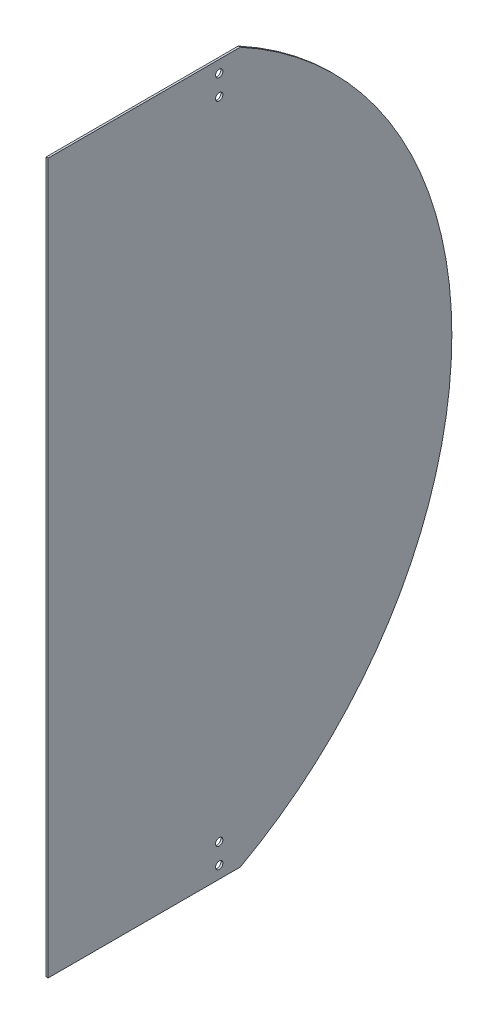
ISO-10303-21;
HEADER;
FILE_DESCRIPTION(('STEP AP214'),'2;1');
FILE_NAME('part.step','',(''),(''),'','','');
FILE_SCHEMA(('AUTOMOTIVE_DESIGN { 1 0 10303 214 1 1 1 1 }'));
ENDSEC;
DATA;
#1=APPLICATION_CONTEXT('core data for automotive mechanical design processes');
#2=APPLICATION_PROTOCOL_DEFINITION('international standard','automotive_design',2000,#1);
#3=PRODUCT_CONTEXT('',#1,'mechanical');
#4=PRODUCT('Part','Part','',(#3));
#5=PRODUCT_RELATED_PRODUCT_CATEGORY('part','',(#4));
#6=PRODUCT_DEFINITION_FORMATION('','',#4);
#7=PRODUCT_DEFINITION_CONTEXT('part definition',#1,'design');
#8=PRODUCT_DEFINITION('design','',#6,#7);
#9=PRODUCT_DEFINITION_SHAPE('','',#8);
#10=(LENGTH_UNIT() NAMED_UNIT(*) SI_UNIT(.MILLI.,.METRE.));
#11=(NAMED_UNIT(*) PLANE_ANGLE_UNIT() SI_UNIT($,.RADIAN.));
#12=(NAMED_UNIT(*) SI_UNIT($,.STERADIAN.) SOLID_ANGLE_UNIT());
#13=UNCERTAINTY_MEASURE_WITH_UNIT(LENGTH_MEASURE(1.E-05),#10,'distance_accuracy_value','');
#14=(GEOMETRIC_REPRESENTATION_CONTEXT(3) GLOBAL_UNCERTAINTY_ASSIGNED_CONTEXT((#13)) GLOBAL_UNIT_ASSIGNED_CONTEXT((#10,
#11,#12)) REPRESENTATION_CONTEXT('',''));
#15=CARTESIAN_POINT('',(0.,0.,0.));
#16=DIRECTION('',(0.,0.,1.));
#17=DIRECTION('',(1.,0.,0.));
#18=AXIS2_PLACEMENT_3D('',#15,#16,#17);
#19=CARTESIAN_POINT('',(-7.5,-398.,-211.));
#20=DIRECTION('',(1.,0.,0.));
#21=DIRECTION('',(0.,0.,-1.));
#22=AXIS2_PLACEMENT_3D('',#19,#20,#21);
#23=CYLINDRICAL_SURFACE('',#22,4.49999999999999);
#24=CARTESIAN_POINT('',(2.5,-398.,-211.));
#25=DIRECTION('',(-1.,0.,0.));
#26=DIRECTION('',(0.,0.,-1.));
#27=AXIS2_PLACEMENT_3D('',#24,#25,#26);
#28=CIRCLE('',#27,4.49999999999999);
#29=CARTESIAN_POINT('',(2.5,-398.,-215.5));
#30=VERTEX_POINT('',#29);
#31=EDGE_CURVE('E51',#30,#30,#28,.T.);
#32=ORIENTED_EDGE('',*,*,#31,.F.);
#33=EDGE_LOOP('',(#32));
#34=FACE_BOUND('',#33,.T.);
#35=CARTESIAN_POINT('',(0.,-398.,-211.));
#36=DIRECTION('',(-1.,0.,0.));
#37=DIRECTION('',(0.,0.,-1.));
#38=AXIS2_PLACEMENT_3D('',#35,#36,#37);
#39=CIRCLE('',#38,4.49999999999999);
#40=CARTESIAN_POINT('',(0.,-398.,-215.5));
#41=VERTEX_POINT('',#40);
#42=EDGE_CURVE('E11',#41,#41,#39,.T.);
#43=ORIENTED_EDGE('',*,*,#42,.T.);
#44=EDGE_LOOP('',(#43));
#45=FACE_BOUND('',#44,.T.);
#46=ADVANCED_FACE('F42',(#34,#45),#23,.F.);
#47=CARTESIAN_POINT('',(-7.5,-423.,-211.));
#48=DIRECTION('',(1.,0.,0.));
#49=DIRECTION('',(0.,0.,-1.));
#50=AXIS2_PLACEMENT_3D('',#47,#48,#49);
#51=CYLINDRICAL_SURFACE('',#50,4.49999999999999);
#52=CARTESIAN_POINT('',(2.5,-423.,-211.));
#53=DIRECTION('',(-1.,0.,0.));
#54=DIRECTION('',(0.,0.,-1.));
#55=AXIS2_PLACEMENT_3D('',#52,#53,#54);
#56=CIRCLE('',#55,4.49999999999999);
#57=CARTESIAN_POINT('',(2.5,-423.,-215.5));
#58=VERTEX_POINT('',#57);
#59=EDGE_CURVE('E132',#58,#58,#56,.T.);
#60=ORIENTED_EDGE('',*,*,#59,.F.);
#61=EDGE_LOOP('',(#60));
#62=FACE_BOUND('',#61,.T.);
#63=CARTESIAN_POINT('',(0.,-423.,-211.));
#64=DIRECTION('',(-1.,0.,0.));
#65=DIRECTION('',(0.,0.,-1.));
#66=AXIS2_PLACEMENT_3D('',#63,#64,#65);
#67=CIRCLE('',#66,4.49999999999999);
#68=CARTESIAN_POINT('',(0.,-423.,-215.5));
#69=VERTEX_POINT('',#68);
#70=EDGE_CURVE('E145',#69,#69,#67,.T.);
#71=ORIENTED_EDGE('',*,*,#70,.T.);
#72=EDGE_LOOP('',(#71));
#73=FACE_BOUND('',#72,.T.);
#74=ADVANCED_FACE('F157',(#62,#73),#51,.F.);
#75=CARTESIAN_POINT('',(2.5,0.,0.));
#76=DIRECTION('',(-1.,0.,0.));
#77=DIRECTION('',(0.,0.,1.));
#78=AXIS2_PLACEMENT_3D('',#75,#76,#77);
#79=CYLINDRICAL_SURFACE('',#78,498.);
#80=CARTESIAN_POINT('',(0.,0.,0.));
#81=DIRECTION('',(1.,0.,0.));
#82=DIRECTION('',(0.,0.,-1.));
#83=AXIS2_PLACEMENT_3D('',#80,#81,#82);
#84=CIRCLE('',#83,498.);
#85=CARTESIAN_POINT('',(0.,-438.,-236.981011897578));
#86=VERTEX_POINT('',#85);
#87=CARTESIAN_POINT('',(0.,438.,-236.981011897578));
#88=VERTEX_POINT('',#87);
#89=EDGE_CURVE('E115',#86,#88,#84,.T.);
#90=ORIENTED_EDGE('',*,*,#89,.T.);
#91=DIRECTION('',(-1.,0.,0.));
#92=VECTOR('',#91,1.);
#93=CARTESIAN_POINT('',(2.5,438.,-236.981011897578));
#94=LINE('',#93,#92);
#95=CARTESIAN_POINT('',(2.5,438.,-236.981011897578));
#96=VERTEX_POINT('',#95);
#97=EDGE_CURVE('E103',#96,#88,#94,.T.);
#98=ORIENTED_EDGE('',*,*,#97,.F.);
#99=CARTESIAN_POINT('',(2.5,0.,0.));
#100=DIRECTION('',(1.,0.,0.));
#101=DIRECTION('',(0.,0.,-1.));
#102=AXIS2_PLACEMENT_3D('',#99,#100,#101);
#103=CIRCLE('',#102,498.);
#104=CARTESIAN_POINT('',(2.5,-438.,-236.981011897578));
#105=VERTEX_POINT('',#104);
#106=EDGE_CURVE('E95',#105,#96,#103,.T.);
#107=ORIENTED_EDGE('',*,*,#106,.F.);
#108=DIRECTION('',(-1.,0.,0.));
#109=VECTOR('',#108,1.);
#110=CARTESIAN_POINT('',(2.5,-438.,-236.981011897578));
#111=LINE('',#110,#109);
#112=EDGE_CURVE('E111',#105,#86,#111,.T.);
#113=ORIENTED_EDGE('',*,*,#112,.T.);
#114=EDGE_LOOP('',(#90,#98,#107,#113));
#115=FACE_BOUND('',#114,.T.);
#116=ADVANCED_FACE('F172',(#115),#79,.T.);
#117=CARTESIAN_POINT('',(2.5,438.,0.));
#118=DIRECTION('',(0.,-1.,0.));
#119=DIRECTION('',(0.,0.,-1.));
#120=AXIS2_PLACEMENT_3D('',#117,#118,#119);
#121=PLANE('',#120);
#122=DIRECTION('',(0.,0.,1.));
#123=VECTOR('',#122,1.);
#124=CARTESIAN_POINT('',(0.,438.,0.));
#125=LINE('',#124,#123);
#126=CARTESIAN_POINT('',(0.,438.,0.));
#127=VERTEX_POINT('',#126);
#128=EDGE_CURVE('E101',#88,#127,#125,.T.);
#129=ORIENTED_EDGE('',*,*,#128,.T.);
#130=DIRECTION('',(-1.,0.,0.));
#131=VECTOR('',#130,1.);
#132=CARTESIAN_POINT('',(2.5,438.,0.));
#133=LINE('',#132,#131);
#134=CARTESIAN_POINT('',(2.5,438.,0.));
#135=VERTEX_POINT('',#134);
#136=EDGE_CURVE('E99',#135,#127,#133,.T.);
#137=ORIENTED_EDGE('',*,*,#136,.F.);
#138=DIRECTION('',(0.,0.,1.));
#139=VECTOR('',#138,1.);
#140=CARTESIAN_POINT('',(2.5,438.,0.));
#141=LINE('',#140,#139);
#142=EDGE_CURVE('E90',#96,#135,#141,.T.);
#143=ORIENTED_EDGE('',*,*,#142,.F.);
#144=ORIENTED_EDGE('',*,*,#97,.T.);
#145=EDGE_LOOP('',(#129,#137,#143,#144));
#146=FACE_BOUND('',#145,.T.);
#147=ADVANCED_FACE('F100',(#146),#121,.F.);
#148=CARTESIAN_POINT('',(2.5,-438.,0.));
#149=DIRECTION('',(0.,0.,-1.));
#150=DIRECTION('',(-1.,0.,0.));
#151=AXIS2_PLACEMENT_3D('',#148,#149,#150);
#152=PLANE('',#151);
#153=DIRECTION('',(0.,-1.,0.));
#154=VECTOR('',#153,1.);
#155=CARTESIAN_POINT('',(0.,-438.,0.));
#156=LINE('',#155,#154);
#157=CARTESIAN_POINT('',(0.,-438.,0.));
#158=VERTEX_POINT('',#157);
#159=EDGE_CURVE('E76',#127,#158,#156,.T.);
#160=ORIENTED_EDGE('',*,*,#159,.T.);
#161=DIRECTION('',(-1.,0.,0.));
#162=VECTOR('',#161,1.);
#163=CARTESIAN_POINT('',(2.5,-438.,0.));
#164=LINE('',#163,#162);
#165=CARTESIAN_POINT('',(2.5,-438.,0.));
#166=VERTEX_POINT('',#165);
#167=EDGE_CURVE('E104',#166,#158,#164,.T.);
#168=ORIENTED_EDGE('',*,*,#167,.F.);
#169=DIRECTION('',(0.,-1.,0.));
#170=VECTOR('',#169,1.);
#171=CARTESIAN_POINT('',(2.5,-438.,0.));
#172=LINE('',#171,#170);
#173=EDGE_CURVE('E93',#135,#166,#172,.T.);
#174=ORIENTED_EDGE('',*,*,#173,.F.);
#175=ORIENTED_EDGE('',*,*,#136,.T.);
#176=EDGE_LOOP('',(#160,#168,#174,#175));
#177=FACE_BOUND('',#176,.T.);
#178=ADVANCED_FACE('F106',(#177),#152,.F.);
#179=CARTESIAN_POINT('',(2.5,-438.,0.));
#180=DIRECTION('',(0.,1.,0.));
#181=DIRECTION('',(0.,0.,1.));
#182=AXIS2_PLACEMENT_3D('',#179,#180,#181);
#183=PLANE('',#182);
#184=DIRECTION('',(0.,0.,-1.));
#185=VECTOR('',#184,1.);
#186=CARTESIAN_POINT('',(0.,-438.,0.));
#187=LINE('',#186,#185);
#188=EDGE_CURVE('E82',#158,#86,#187,.T.);
#189=ORIENTED_EDGE('',*,*,#188,.T.);
#190=ORIENTED_EDGE('',*,*,#112,.F.);
#191=DIRECTION('',(0.,0.,-1.));
#192=VECTOR('',#191,1.);
#193=CARTESIAN_POINT('',(2.5,-438.,0.));
#194=LINE('',#193,#192);
#195=EDGE_CURVE('E59',#166,#105,#194,.T.);
#196=ORIENTED_EDGE('',*,*,#195,.F.);
#197=ORIENTED_EDGE('',*,*,#167,.T.);
#198=EDGE_LOOP('',(#189,#190,#196,#197));
#199=FACE_BOUND('',#198,.T.);
#200=ADVANCED_FACE('F173',(#199),#183,.F.);
#201=CARTESIAN_POINT('',(2.5,0.,0.));
#202=DIRECTION('',(1.,0.,0.));
#203=DIRECTION('',(0.,0.,-1.));
#204=AXIS2_PLACEMENT_3D('',#201,#202,#203);
#205=PLANE('',#204);
#206=ORIENTED_EDGE('',*,*,#59,.T.);
#207=EDGE_LOOP('',(#206));
#208=FACE_BOUND('',#207,.T.);
#209=ORIENTED_EDGE('',*,*,#31,.T.);
#210=EDGE_LOOP('',(#209));
#211=FACE_BOUND('',#210,.T.);
#212=CARTESIAN_POINT('',(2.5,398.,-211.));
#213=DIRECTION('',(1.,0.,0.));
#214=DIRECTION('',(0.,0.,-1.));
#215=AXIS2_PLACEMENT_3D('',#212,#213,#214);
#216=CIRCLE('',#215,4.49999999999999);
#217=CARTESIAN_POINT('',(2.5,398.,-215.5));
#218=VERTEX_POINT('',#217);
#219=EDGE_CURVE('E141',#218,#218,#216,.T.);
#220=ORIENTED_EDGE('',*,*,#219,.F.);
#221=EDGE_LOOP('',(#220));
#222=FACE_BOUND('',#221,.T.);
#223=CARTESIAN_POINT('',(2.5,423.,-211.));
#224=DIRECTION('',(1.,0.,0.));
#225=DIRECTION('',(0.,0.,-1.));
#226=AXIS2_PLACEMENT_3D('',#223,#224,#225);
#227=CIRCLE('',#226,4.49999999999999);
#228=CARTESIAN_POINT('',(2.5,423.,-215.5));
#229=VERTEX_POINT('',#228);
#230=EDGE_CURVE('E136',#229,#229,#227,.T.);
#231=ORIENTED_EDGE('',*,*,#230,.F.);
#232=EDGE_LOOP('',(#231));
#233=FACE_BOUND('',#232,.T.);
#234=ORIENTED_EDGE('',*,*,#106,.T.);
#235=ORIENTED_EDGE('',*,*,#142,.T.);
#236=ORIENTED_EDGE('',*,*,#173,.T.);
#237=ORIENTED_EDGE('',*,*,#195,.T.);
#238=EDGE_LOOP('',(#234,#235,#236,#237));
#239=FACE_BOUND('',#238,.T.);
#240=ADVANCED_FACE('F91',(#208,#211,#222,#233,#239),#205,.T.);
#241=CARTESIAN_POINT('',(0.,0.,0.));
#242=DIRECTION('',(1.,0.,0.));
#243=DIRECTION('',(0.,0.,-1.));
#244=AXIS2_PLACEMENT_3D('',#241,#242,#243);
#245=PLANE('',#244);
#246=ORIENTED_EDGE('',*,*,#70,.F.);
#247=EDGE_LOOP('',(#246));
#248=FACE_BOUND('',#247,.T.);
#249=ORIENTED_EDGE('',*,*,#42,.F.);
#250=EDGE_LOOP('',(#249));
#251=FACE_BOUND('',#250,.T.);
#252=CARTESIAN_POINT('',(0.,398.,-211.));
#253=DIRECTION('',(1.,0.,0.));
#254=DIRECTION('',(0.,0.,-1.));
#255=AXIS2_PLACEMENT_3D('',#252,#253,#254);
#256=CIRCLE('',#255,4.49999999999999);
#257=CARTESIAN_POINT('',(0.,398.,-215.5));
#258=VERTEX_POINT('',#257);
#259=EDGE_CURVE('E137',#258,#258,#256,.T.);
#260=ORIENTED_EDGE('',*,*,#259,.T.);
#261=EDGE_LOOP('',(#260));
#262=FACE_BOUND('',#261,.T.);
#263=CARTESIAN_POINT('',(0.,423.,-211.));
#264=DIRECTION('',(1.,0.,0.));
#265=DIRECTION('',(0.,0.,-1.));
#266=AXIS2_PLACEMENT_3D('',#263,#264,#265);
#267=CIRCLE('',#266,4.49999999999999);
#268=CARTESIAN_POINT('',(0.,423.,-215.5));
#269=VERTEX_POINT('',#268);
#270=EDGE_CURVE('E119',#269,#269,#267,.T.);
#271=ORIENTED_EDGE('',*,*,#270,.T.);
#272=EDGE_LOOP('',(#271));
#273=FACE_BOUND('',#272,.T.);
#274=ORIENTED_EDGE('',*,*,#89,.F.);
#275=ORIENTED_EDGE('',*,*,#188,.F.);
#276=ORIENTED_EDGE('',*,*,#159,.F.);
#277=ORIENTED_EDGE('',*,*,#128,.F.);
#278=EDGE_LOOP('',(#274,#275,#276,#277));
#279=FACE_BOUND('',#278,.T.);
#280=ADVANCED_FACE('F160',(#248,#251,#262,#273,#279),#245,.F.);
#281=CARTESIAN_POINT('',(-7.5,423.,-211.));
#282=DIRECTION('',(1.,0.,0.));
#283=DIRECTION('',(0.,0.,-1.));
#284=AXIS2_PLACEMENT_3D('',#281,#282,#283);
#285=CYLINDRICAL_SURFACE('',#284,4.49999999999999);
#286=ORIENTED_EDGE('',*,*,#230,.T.);
#287=EDGE_LOOP('',(#286));
#288=FACE_BOUND('',#287,.T.);
#289=ORIENTED_EDGE('',*,*,#270,.F.);
#290=EDGE_LOOP('',(#289));
#291=FACE_BOUND('',#290,.T.);
#292=ADVANCED_FACE('F163',(#288,#291),#285,.F.);
#293=CARTESIAN_POINT('',(-7.5,398.,-211.));
#294=DIRECTION('',(1.,0.,0.));
#295=DIRECTION('',(0.,0.,-1.));
#296=AXIS2_PLACEMENT_3D('',#293,#294,#295);
#297=CYLINDRICAL_SURFACE('',#296,4.49999999999999);
#298=ORIENTED_EDGE('',*,*,#219,.T.);
#299=EDGE_LOOP('',(#298));
#300=FACE_BOUND('',#299,.T.);
#301=ORIENTED_EDGE('',*,*,#259,.F.);
#302=EDGE_LOOP('',(#301));
#303=FACE_BOUND('',#302,.T.);
#304=ADVANCED_FACE('F233',(#300,#303),#297,.F.);
#305=CLOSED_SHELL('',(#46,#74,#116,#147,#178,#200,#240,#280,#292,#304));
#306=MANIFOLD_SOLID_BREP('B2',#305);
#307=ADVANCED_BREP_SHAPE_REPRESENTATION('',(#18,#306),#14);
#308=SHAPE_DEFINITION_REPRESENTATION(#9,#307);
ENDSEC;
END-ISO-10303-21;
